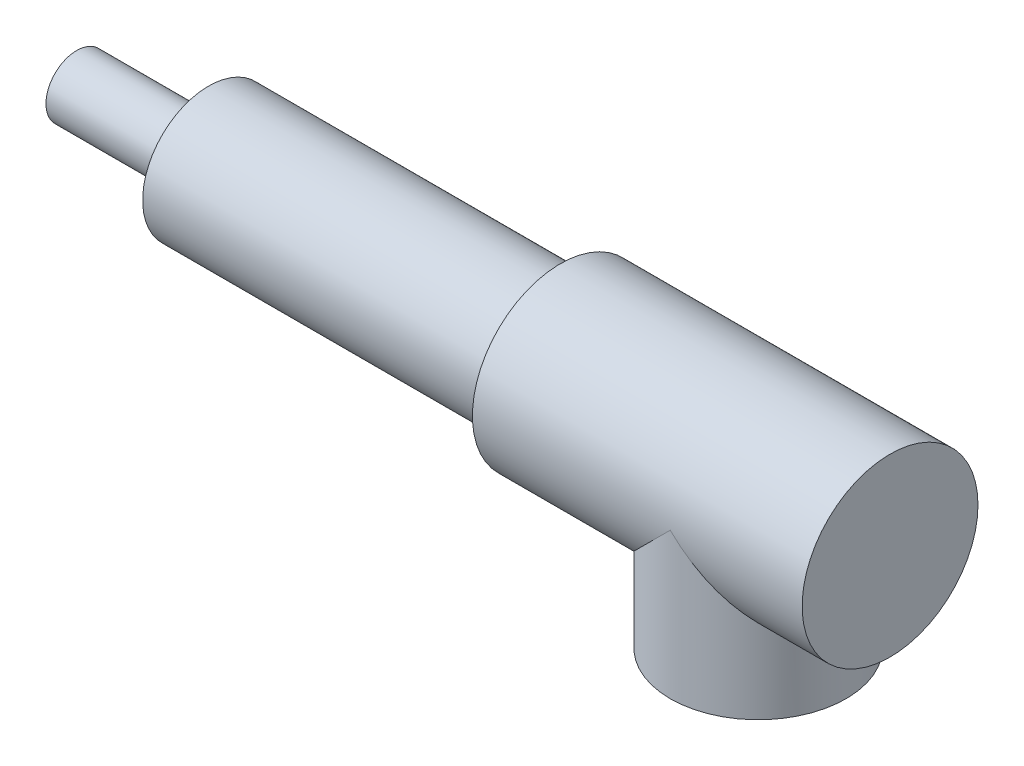
ISO-10303-21;
HEADER;
FILE_DESCRIPTION(('STEP AP214'),'2;1');
FILE_NAME('part.step','',(''),(''),'','','');
FILE_SCHEMA(('AUTOMOTIVE_DESIGN { 1 0 10303 214 1 1 1 1 }'));
ENDSEC;
DATA;
#1=APPLICATION_CONTEXT('core data for automotive mechanical design processes');
#2=APPLICATION_PROTOCOL_DEFINITION('international standard','automotive_design',2000,#1);
#3=PRODUCT_CONTEXT('',#1,'mechanical');
#4=PRODUCT('Part','Part','',(#3));
#5=PRODUCT_RELATED_PRODUCT_CATEGORY('part','',(#4));
#6=PRODUCT_DEFINITION_FORMATION('','',#4);
#7=PRODUCT_DEFINITION_CONTEXT('part definition',#1,'design');
#8=PRODUCT_DEFINITION('design','',#6,#7);
#9=PRODUCT_DEFINITION_SHAPE('','',#8);
#10=(LENGTH_UNIT() NAMED_UNIT(*) SI_UNIT(.MILLI.,.METRE.));
#11=(NAMED_UNIT(*) PLANE_ANGLE_UNIT() SI_UNIT($,.RADIAN.));
#12=(NAMED_UNIT(*) SI_UNIT($,.STERADIAN.) SOLID_ANGLE_UNIT());
#13=UNCERTAINTY_MEASURE_WITH_UNIT(LENGTH_MEASURE(1.E-05),#10,'distance_accuracy_value','');
#14=(GEOMETRIC_REPRESENTATION_CONTEXT(3) GLOBAL_UNCERTAINTY_ASSIGNED_CONTEXT((#13)) GLOBAL_UNIT_ASSIGNED_CONTEXT((#10,
#11,#12)) REPRESENTATION_CONTEXT('',''));
#15=CARTESIAN_POINT('',(0.,0.,0.));
#16=DIRECTION('',(0.,0.,1.));
#17=DIRECTION('',(1.,0.,0.));
#18=AXIS2_PLACEMENT_3D('',#15,#16,#17);
#19=CARTESIAN_POINT('',(0.,0.,0.));
#20=DIRECTION('',(1.,0.,0.));
#21=DIRECTION('',(0.,0.,-1.));
#22=AXIS2_PLACEMENT_3D('',#19,#20,#21);
#23=PLANE('',#22);
#24=CARTESIAN_POINT('',(0.,0.,0.));
#25=DIRECTION('',(1.,0.,0.));
#26=DIRECTION('',(0.,0.,-1.));
#27=AXIS2_PLACEMENT_3D('',#24,#25,#26);
#28=CIRCLE('',#27,15.);
#29=CARTESIAN_POINT('',(0.,0.,-15.));
#30=VERTEX_POINT('',#29);
#31=EDGE_CURVE('E71',#30,#30,#28,.T.);
#32=ORIENTED_EDGE('',*,*,#31,.T.);
#33=EDGE_LOOP('',(#32));
#34=FACE_BOUND('',#33,.T.);
#35=CARTESIAN_POINT('',(0.,0.,0.));
#36=DIRECTION('',(1.,0.,0.));
#37=DIRECTION('',(0.,0.,-1.));
#38=AXIS2_PLACEMENT_3D('',#35,#36,#37);
#39=CIRCLE('',#38,20.);
#40=CARTESIAN_POINT('',(0.,0.,-20.));
#41=VERTEX_POINT('',#40);
#42=EDGE_CURVE('E54',#41,#41,#39,.T.);
#43=ORIENTED_EDGE('',*,*,#42,.F.);
#44=EDGE_LOOP('',(#43));
#45=FACE_BOUND('',#44,.T.);
#46=ADVANCED_FACE('F35',(#34,#45),#23,.F.);
#47=CARTESIAN_POINT('',(75.,0.,0.));
#48=DIRECTION('',(1.,0.,0.));
#49=DIRECTION('',(0.,0.,-1.));
#50=AXIS2_PLACEMENT_3D('',#47,#48,#49);
#51=PLANE('',#50);
#52=CARTESIAN_POINT('',(75.,0.,0.));
#53=DIRECTION('',(1.,0.,0.));
#54=DIRECTION('',(0.,0.,-1.));
#55=AXIS2_PLACEMENT_3D('',#52,#53,#54);
#56=CIRCLE('',#55,20.);
#57=CARTESIAN_POINT('',(75.,0.,-20.));
#58=VERTEX_POINT('',#57);
#59=EDGE_CURVE('E52',#58,#58,#56,.T.);
#60=ORIENTED_EDGE('',*,*,#59,.T.);
#61=EDGE_LOOP('',(#60));
#62=FACE_BOUND('',#61,.T.);
#63=ADVANCED_FACE('F89',(#62),#51,.T.);
#64=CARTESIAN_POINT('',(0.,0.,0.));
#65=DIRECTION('',(1.,0.,0.));
#66=DIRECTION('',(0.,0.,-1.));
#67=AXIS2_PLACEMENT_3D('',#64,#65,#66);
#68=CYLINDRICAL_SURFACE('',#67,20.);
#69=CARTESIAN_POINT('',(45.,0.,0.));
#70=DIRECTION('',(0.707106781186548,0.707106781186547,0.));
#71=DIRECTION('',(0.707106781186548,-0.707106781186547,0.));
#72=AXIS2_PLACEMENT_3D('',#69,#70,#71);
#73=ELLIPSE('',#72,28.2842712474619,20.);
#74=CARTESIAN_POINT('',(45.,0.,-20.));
#75=VERTEX_POINT('',#74);
#76=CARTESIAN_POINT('',(45.,0.,20.));
#77=VERTEX_POINT('',#76);
#78=EDGE_CURVE('E11',#75,#77,#73,.F.);
#79=ORIENTED_EDGE('',*,*,#78,.F.);
#80=CARTESIAN_POINT('',(45.,0.,0.));
#81=DIRECTION('',(0.707106781186548,-0.707106781186547,0.));
#82=DIRECTION('',(0.707106781186548,0.707106781186547,0.));
#83=AXIS2_PLACEMENT_3D('',#80,#81,#82);
#84=ELLIPSE('',#83,28.2842712474619,20.);
#85=EDGE_CURVE('E42',#77,#75,#84,.T.);
#86=ORIENTED_EDGE('',*,*,#85,.F.);
#87=EDGE_LOOP('',(#79,#86));
#88=FACE_BOUND('',#87,.T.);
#89=ORIENTED_EDGE('',*,*,#59,.F.);
#90=EDGE_LOOP('',(#89));
#91=FACE_BOUND('',#90,.T.);
#92=ORIENTED_EDGE('',*,*,#42,.T.);
#93=EDGE_LOOP('',(#92));
#94=FACE_BOUND('',#93,.T.);
#95=ADVANCED_FACE('F48',(#88,#91,#94),#68,.T.);
#96=CARTESIAN_POINT('',(45.,-33.2,0.));
#97=DIRECTION('',(0.,1.,0.));
#98=DIRECTION('',(0.,0.,1.));
#99=AXIS2_PLACEMENT_3D('',#96,#97,#98);
#100=CYLINDRICAL_SURFACE('',#99,20.);
#101=CARTESIAN_POINT('',(45.,-33.2,0.));
#102=DIRECTION('',(0.,1.,0.));
#103=DIRECTION('',(0.,0.,1.));
#104=AXIS2_PLACEMENT_3D('',#101,#102,#103);
#105=CIRCLE('',#104,20.);
#106=CARTESIAN_POINT('',(45.,-33.2,20.));
#107=VERTEX_POINT('',#106);
#108=EDGE_CURVE('E59',#107,#107,#105,.T.);
#109=ORIENTED_EDGE('',*,*,#108,.T.);
#110=EDGE_LOOP('',(#109));
#111=FACE_BOUND('',#110,.T.);
#112=ORIENTED_EDGE('',*,*,#85,.T.);
#113=ORIENTED_EDGE('',*,*,#78,.T.);
#114=EDGE_LOOP('',(#112,#113));
#115=FACE_BOUND('',#114,.T.);
#116=ADVANCED_FACE('F51',(#111,#115),#100,.T.);
#117=CARTESIAN_POINT('',(45.,-33.2,0.));
#118=DIRECTION('',(0.,1.,0.));
#119=DIRECTION('',(0.,0.,1.));
#120=AXIS2_PLACEMENT_3D('',#117,#118,#119);
#121=PLANE('',#120);
#122=ORIENTED_EDGE('',*,*,#108,.F.);
#123=EDGE_LOOP('',(#122));
#124=FACE_BOUND('',#123,.T.);
#125=ADVANCED_FACE('F95',(#124),#121,.F.);
#126=CARTESIAN_POINT('',(-110.,0.,0.));
#127=DIRECTION('',(-1.,0.,0.));
#128=DIRECTION('',(0.,0.,1.));
#129=AXIS2_PLACEMENT_3D('',#126,#127,#128);
#130=PLANE('',#129);
#131=CARTESIAN_POINT('',(-110.,0.,0.));
#132=DIRECTION('',(1.,0.,0.));
#133=DIRECTION('',(0.,0.,-1.));
#134=AXIS2_PLACEMENT_3D('',#131,#132,#133);
#135=CIRCLE('',#134,7.);
#136=CARTESIAN_POINT('',(-110.,0.,-7.));
#137=VERTEX_POINT('',#136);
#138=EDGE_CURVE('E62',#137,#137,#135,.T.);
#139=ORIENTED_EDGE('',*,*,#138,.F.);
#140=EDGE_LOOP('',(#139));
#141=FACE_BOUND('',#140,.T.);
#142=ADVANCED_FACE('F102',(#141),#130,.T.);
#143=CARTESIAN_POINT('',(-110.,0.,0.));
#144=DIRECTION('',(1.,0.,0.));
#145=DIRECTION('',(0.,0.,-1.));
#146=AXIS2_PLACEMENT_3D('',#143,#144,#145);
#147=CYLINDRICAL_SURFACE('',#146,7.);
#148=ORIENTED_EDGE('',*,*,#138,.T.);
#149=EDGE_LOOP('',(#148));
#150=FACE_BOUND('',#149,.T.);
#151=CARTESIAN_POINT('',(-80.,0.,0.));
#152=DIRECTION('',(1.,0.,0.));
#153=DIRECTION('',(0.,0.,-1.));
#154=AXIS2_PLACEMENT_3D('',#151,#152,#153);
#155=CIRCLE('',#154,7.);
#156=CARTESIAN_POINT('',(-80.,0.,-7.));
#157=VERTEX_POINT('',#156);
#158=EDGE_CURVE('E65',#157,#157,#155,.T.);
#159=ORIENTED_EDGE('',*,*,#158,.F.);
#160=EDGE_LOOP('',(#159));
#161=FACE_BOUND('',#160,.T.);
#162=ADVANCED_FACE('F85',(#150,#161),#147,.T.);
#163=CARTESIAN_POINT('',(-80.,0.,-7.));
#164=DIRECTION('',(-1.,0.,0.));
#165=DIRECTION('',(0.,0.,1.));
#166=AXIS2_PLACEMENT_3D('',#163,#164,#165);
#167=PLANE('',#166);
#168=ORIENTED_EDGE('',*,*,#158,.T.);
#169=EDGE_LOOP('',(#168));
#170=FACE_BOUND('',#169,.T.);
#171=CARTESIAN_POINT('',(-80.,0.,0.));
#172=DIRECTION('',(1.,0.,0.));
#173=DIRECTION('',(0.,0.,-1.));
#174=AXIS2_PLACEMENT_3D('',#171,#172,#173);
#175=CIRCLE('',#174,15.);
#176=CARTESIAN_POINT('',(-80.,0.,-15.));
#177=VERTEX_POINT('',#176);
#178=EDGE_CURVE('E68',#177,#177,#175,.T.);
#179=ORIENTED_EDGE('',*,*,#178,.F.);
#180=EDGE_LOOP('',(#179));
#181=FACE_BOUND('',#180,.T.);
#182=ADVANCED_FACE('F79',(#170,#181),#167,.T.);
#183=CARTESIAN_POINT('',(-110.,0.,0.));
#184=DIRECTION('',(1.,0.,0.));
#185=DIRECTION('',(0.,0.,-1.));
#186=AXIS2_PLACEMENT_3D('',#183,#184,#185);
#187=CYLINDRICAL_SURFACE('',#186,15.);
#188=ORIENTED_EDGE('',*,*,#178,.T.);
#189=EDGE_LOOP('',(#188));
#190=FACE_BOUND('',#189,.T.);
#191=ORIENTED_EDGE('',*,*,#31,.F.);
#192=EDGE_LOOP('',(#191));
#193=FACE_BOUND('',#192,.T.);
#194=ADVANCED_FACE('F77',(#190,#193),#187,.T.);
#195=CLOSED_SHELL('',(#46,#63,#95,#116,#125,#142,#162,#182,#194));
#196=MANIFOLD_SOLID_BREP('B2',#195);
#197=ADVANCED_BREP_SHAPE_REPRESENTATION('',(#18,#196),#14);
#198=SHAPE_DEFINITION_REPRESENTATION(#9,#197);
ENDSEC;
END-ISO-10303-21;
